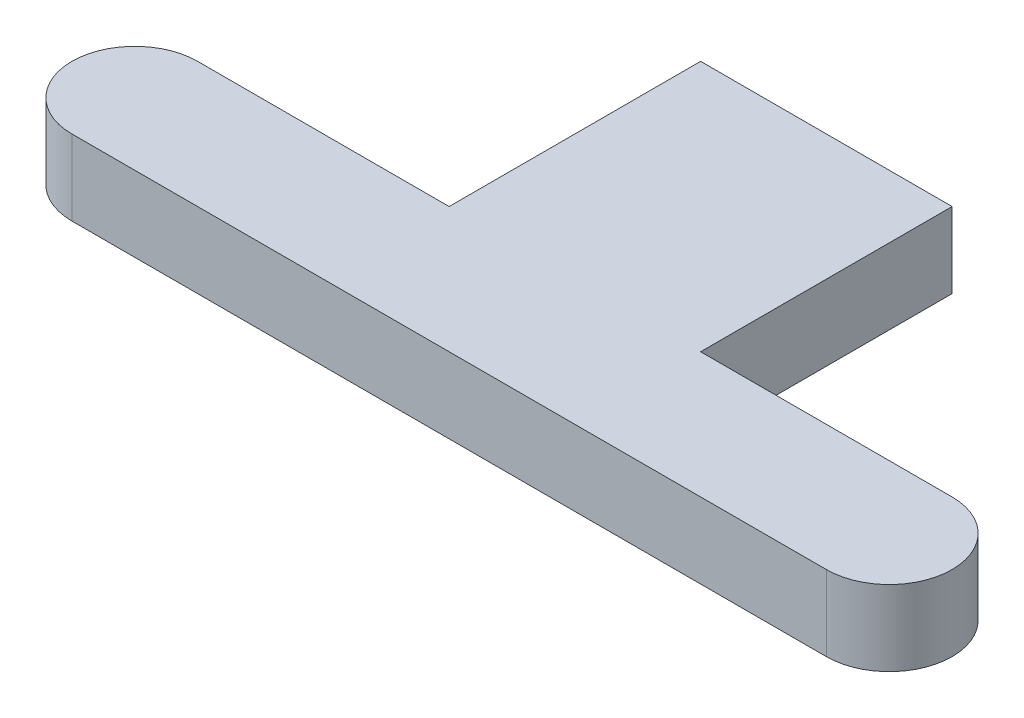
ISO-10303-21;
HEADER;
FILE_DESCRIPTION(('STEP AP214'),'2;1');
FILE_NAME('part.step','',(''),(''),'','','');
FILE_SCHEMA(('AUTOMOTIVE_DESIGN { 1 0 10303 214 1 1 1 1 }'));
ENDSEC;
DATA;
#1=APPLICATION_CONTEXT('core data for automotive mechanical design processes');
#2=APPLICATION_PROTOCOL_DEFINITION('international standard','automotive_design',2000,#1);
#3=PRODUCT_CONTEXT('',#1,'mechanical');
#4=PRODUCT('Part','Part','',(#3));
#5=PRODUCT_RELATED_PRODUCT_CATEGORY('part','',(#4));
#6=PRODUCT_DEFINITION_FORMATION('','',#4);
#7=PRODUCT_DEFINITION_CONTEXT('part definition',#1,'design');
#8=PRODUCT_DEFINITION('design','',#6,#7);
#9=PRODUCT_DEFINITION_SHAPE('','',#8);
#10=(LENGTH_UNIT() NAMED_UNIT(*) SI_UNIT(.MILLI.,.METRE.));
#11=(NAMED_UNIT(*) PLANE_ANGLE_UNIT() SI_UNIT($,.RADIAN.));
#12=(NAMED_UNIT(*) SI_UNIT($,.STERADIAN.) SOLID_ANGLE_UNIT());
#13=UNCERTAINTY_MEASURE_WITH_UNIT(LENGTH_MEASURE(1.E-05),#10,'distance_accuracy_value','');
#14=(GEOMETRIC_REPRESENTATION_CONTEXT(3) GLOBAL_UNCERTAINTY_ASSIGNED_CONTEXT((#13)) GLOBAL_UNIT_ASSIGNED_CONTEXT((#10,
#11,#12)) REPRESENTATION_CONTEXT('',''));
#15=CARTESIAN_POINT('',(0.,0.,0.));
#16=DIRECTION('',(0.,0.,1.));
#17=DIRECTION('',(1.,0.,0.));
#18=AXIS2_PLACEMENT_3D('',#15,#16,#17);
#19=CARTESIAN_POINT('',(-7.49999999999999,3.,-5.));
#20=DIRECTION('',(0.,0.,1.));
#21=DIRECTION('',(1.,0.,0.));
#22=AXIS2_PLACEMENT_3D('',#19,#20,#21);
#23=PLANE('',#22);
#24=DIRECTION('',(0.,-1.,0.));
#25=VECTOR('',#24,1.);
#26=CARTESIAN_POINT('',(12.5,3.,-5.));
#27=LINE('',#26,#25);
#28=CARTESIAN_POINT('',(12.5,3.,-5.));
#29=VERTEX_POINT('',#28);
#30=CARTESIAN_POINT('',(12.5,0.,-5.));
#31=VERTEX_POINT('',#30);
#32=EDGE_CURVE('E63',#29,#31,#27,.T.);
#33=ORIENTED_EDGE('',*,*,#32,.F.);
#34=DIRECTION('',(-1.,0.,0.));
#35=VECTOR('',#34,1.);
#36=CARTESIAN_POINT('',(-7.49999999999999,3.,-5.));
#37=LINE('',#36,#35);
#38=CARTESIAN_POINT('',(22.5,3.,-5.));
#39=VERTEX_POINT('',#38);
#40=EDGE_CURVE('E220',#39,#29,#37,.T.);
#41=ORIENTED_EDGE('',*,*,#40,.F.);
#42=DIRECTION('',(0.,-1.,0.));
#43=VECTOR('',#42,1.);
#44=CARTESIAN_POINT('',(22.5,3.,-5.));
#45=LINE('',#44,#43);
#46=CARTESIAN_POINT('',(22.5,0.,-5.));
#47=VERTEX_POINT('',#46);
#48=EDGE_CURVE('E239',#39,#47,#45,.T.);
#49=ORIENTED_EDGE('',*,*,#48,.T.);
#50=DIRECTION('',(-1.,0.,0.));
#51=VECTOR('',#50,1.);
#52=CARTESIAN_POINT('',(-7.49999999999999,0.,-5.));
#53=LINE('',#52,#51);
#54=EDGE_CURVE('E214',#47,#31,#53,.T.);
#55=ORIENTED_EDGE('',*,*,#54,.T.);
#56=EDGE_LOOP('',(#33,#41,#49,#55));
#57=FACE_BOUND('',#56,.T.);
#58=ADVANCED_FACE('F39',(#57),#23,.F.);
#59=DIRECTION('',(0.,1.,0.));
#60=VECTOR('',#59,1.);
#61=CARTESIAN_POINT('',(2.50000000000001,3.,-5.));
#62=LINE('',#61,#60);
#63=CARTESIAN_POINT('',(2.5,0.,-5.));
#64=VERTEX_POINT('',#63);
#65=CARTESIAN_POINT('',(2.5,3.,-5.));
#66=VERTEX_POINT('',#65);
#67=EDGE_CURVE('E154',#64,#66,#62,.T.);
#68=ORIENTED_EDGE('',*,*,#67,.F.);
#69=CARTESIAN_POINT('',(-7.49999999999999,0.,-5.));
#70=VERTEX_POINT('',#69);
#71=EDGE_CURVE('E233',#64,#70,#53,.T.);
#72=ORIENTED_EDGE('',*,*,#71,.T.);
#73=DIRECTION('',(0.,-1.,0.));
#74=VECTOR('',#73,1.);
#75=CARTESIAN_POINT('',(-7.49999999999999,3.,-5.));
#76=LINE('',#75,#74);
#77=CARTESIAN_POINT('',(-7.49999999999999,3.,-5.));
#78=VERTEX_POINT('',#77);
#79=EDGE_CURVE('E223',#78,#70,#76,.T.);
#80=ORIENTED_EDGE('',*,*,#79,.F.);
#81=EDGE_CURVE('E55',#66,#78,#37,.T.);
#82=ORIENTED_EDGE('',*,*,#81,.F.);
#83=EDGE_LOOP('',(#68,#72,#80,#82));
#84=FACE_BOUND('',#83,.T.);
#85=ADVANCED_FACE('F272',(#84),#23,.F.);
#86=CARTESIAN_POINT('',(-7.49999999999999,3.,-2.49999999999998));
#87=DIRECTION('',(0.,-1.,0.));
#88=DIRECTION('',(0.,0.,-1.));
#89=AXIS2_PLACEMENT_3D('',#86,#87,#88);
#90=CYLINDRICAL_SURFACE('',#89,2.50000000000002);
#91=CARTESIAN_POINT('',(-7.49999999999999,0.,-2.49999999999998));
#92=DIRECTION('',(0.,1.,0.));
#93=DIRECTION('',(0.,0.,1.));
#94=AXIS2_PLACEMENT_3D('',#91,#92,#93);
#95=CIRCLE('',#94,2.50000000000002);
#96=CARTESIAN_POINT('',(-7.49999955071812,0.,0.));
#97=VERTEX_POINT('',#96);
#98=EDGE_CURVE('E199',#70,#97,#95,.T.);
#99=ORIENTED_EDGE('',*,*,#98,.T.);
#100=DIRECTION('',(0.,-1.,0.));
#101=VECTOR('',#100,1.);
#102=CARTESIAN_POINT('',(-7.49999955071812,3.,0.));
#103=LINE('',#102,#101);
#104=CARTESIAN_POINT('',(-7.49999955071812,3.,0.));
#105=VERTEX_POINT('',#104);
#106=EDGE_CURVE('E11',#105,#97,#103,.T.);
#107=ORIENTED_EDGE('',*,*,#106,.F.);
#108=CARTESIAN_POINT('',(-7.49999999999999,3.,-2.49999999999998));
#109=DIRECTION('',(0.,1.,0.));
#110=DIRECTION('',(0.,0.,1.));
#111=AXIS2_PLACEMENT_3D('',#108,#109,#110);
#112=CIRCLE('',#111,2.50000000000002);
#113=EDGE_CURVE('E209',#78,#105,#112,.T.);
#114=ORIENTED_EDGE('',*,*,#113,.F.);
#115=ORIENTED_EDGE('',*,*,#79,.T.);
#116=EDGE_LOOP('',(#99,#107,#114,#115));
#117=FACE_BOUND('',#116,.T.);
#118=ADVANCED_FACE('F41',(#117),#90,.T.);
#119=CARTESIAN_POINT('',(-7.49999955071812,3.,0.));
#120=DIRECTION('',(0.,0.,-1.));
#121=DIRECTION('',(-1.,0.,0.));
#122=AXIS2_PLACEMENT_3D('',#119,#120,#121);
#123=PLANE('',#122);
#124=DIRECTION('',(1.,0.,0.));
#125=VECTOR('',#124,1.);
#126=CARTESIAN_POINT('',(-7.49999955071812,0.,0.));
#127=LINE('',#126,#125);
#128=CARTESIAN_POINT('',(22.5,0.,0.));
#129=VERTEX_POINT('',#128);
#130=EDGE_CURVE('E227',#97,#129,#127,.T.);
#131=ORIENTED_EDGE('',*,*,#130,.T.);
#132=DIRECTION('',(0.,-1.,0.));
#133=VECTOR('',#132,1.);
#134=CARTESIAN_POINT('',(22.5,3.,0.));
#135=LINE('',#134,#133);
#136=CARTESIAN_POINT('',(22.5,3.,0.));
#137=VERTEX_POINT('',#136);
#138=EDGE_CURVE('E48',#137,#129,#135,.T.);
#139=ORIENTED_EDGE('',*,*,#138,.F.);
#140=DIRECTION('',(1.,0.,0.));
#141=VECTOR('',#140,1.);
#142=CARTESIAN_POINT('',(-7.49999955071812,3.,0.));
#143=LINE('',#142,#141);
#144=EDGE_CURVE('E213',#105,#137,#143,.T.);
#145=ORIENTED_EDGE('',*,*,#144,.F.);
#146=ORIENTED_EDGE('',*,*,#106,.T.);
#147=EDGE_LOOP('',(#131,#139,#145,#146));
#148=FACE_BOUND('',#147,.T.);
#149=ADVANCED_FACE('F274',(#148),#123,.F.);
#150=CARTESIAN_POINT('',(22.5,3.,-2.5));
#151=DIRECTION('',(0.,-1.,0.));
#152=DIRECTION('',(0.,0.,-1.));
#153=AXIS2_PLACEMENT_3D('',#150,#151,#152);
#154=CYLINDRICAL_SURFACE('',#153,2.5);
#155=CARTESIAN_POINT('',(22.5,0.,-2.5));
#156=DIRECTION('',(0.,1.,0.));
#157=DIRECTION('',(0.,0.,1.));
#158=AXIS2_PLACEMENT_3D('',#155,#156,#157);
#159=CIRCLE('',#158,2.5);
#160=EDGE_CURVE('E230',#129,#47,#159,.T.);
#161=ORIENTED_EDGE('',*,*,#160,.T.);
#162=ORIENTED_EDGE('',*,*,#48,.F.);
#163=CARTESIAN_POINT('',(22.5,3.,-2.5));
#164=DIRECTION('',(0.,1.,0.));
#165=DIRECTION('',(0.,0.,1.));
#166=AXIS2_PLACEMENT_3D('',#163,#164,#165);
#167=CIRCLE('',#166,2.5);
#168=EDGE_CURVE('E217',#137,#39,#167,.T.);
#169=ORIENTED_EDGE('',*,*,#168,.F.);
#170=ORIENTED_EDGE('',*,*,#138,.T.);
#171=EDGE_LOOP('',(#161,#162,#169,#170));
#172=FACE_BOUND('',#171,.T.);
#173=ADVANCED_FACE('F248',(#172),#154,.T.);
#174=CARTESIAN_POINT('',(-7.49999999999999,3.,-2.49999999999998));
#175=DIRECTION('',(0.,1.,0.));
#176=DIRECTION('',(0.,0.,1.));
#177=AXIS2_PLACEMENT_3D('',#174,#175,#176);
#178=PLANE('',#177);
#179=ORIENTED_EDGE('',*,*,#113,.T.);
#180=ORIENTED_EDGE('',*,*,#144,.T.);
#181=ORIENTED_EDGE('',*,*,#168,.T.);
#182=ORIENTED_EDGE('',*,*,#40,.T.);
#183=DIRECTION('',(0.,0.,1.));
#184=VECTOR('',#183,1.);
#185=CARTESIAN_POINT('',(12.5,3.,-15.));
#186=LINE('',#185,#184);
#187=CARTESIAN_POINT('',(12.5,3.,-15.));
#188=VERTEX_POINT('',#187);
#189=EDGE_CURVE('E253',#188,#29,#186,.T.);
#190=ORIENTED_EDGE('',*,*,#189,.F.);
#191=DIRECTION('',(1.,0.,0.));
#192=VECTOR('',#191,1.);
#193=CARTESIAN_POINT('',(12.5,3.,-15.));
#194=LINE('',#193,#192);
#195=CARTESIAN_POINT('',(2.5,3.,-15.));
#196=VERTEX_POINT('',#195);
#197=EDGE_CURVE('E149',#196,#188,#194,.T.);
#198=ORIENTED_EDGE('',*,*,#197,.F.);
#199=DIRECTION('',(0.,0.,1.));
#200=VECTOR('',#199,1.);
#201=CARTESIAN_POINT('',(2.5,3.,-15.));
#202=LINE('',#201,#200);
#203=EDGE_CURVE('E164',#196,#66,#202,.T.);
#204=ORIENTED_EDGE('',*,*,#203,.T.);
#205=ORIENTED_EDGE('',*,*,#81,.T.);
#206=EDGE_LOOP('',(#179,#180,#181,#182,#190,#198,#204,#205));
#207=FACE_BOUND('',#206,.T.);
#208=ADVANCED_FACE('F252',(#207),#178,.T.);
#209=CARTESIAN_POINT('',(-7.49999999999999,0.,-2.49999999999998));
#210=DIRECTION('',(0.,1.,0.));
#211=DIRECTION('',(0.,0.,1.));
#212=AXIS2_PLACEMENT_3D('',#209,#210,#211);
#213=PLANE('',#212);
#214=DIRECTION('',(1.,0.,0.));
#215=VECTOR('',#214,1.);
#216=CARTESIAN_POINT('',(-7.49999999999999,0.,-4.));
#217=LINE('',#216,#215);
#218=CARTESIAN_POINT('',(-7.49999999999999,0.,-4.));
#219=VERTEX_POINT('',#218);
#220=CARTESIAN_POINT('',(22.5,0.,-4.));
#221=VERTEX_POINT('',#220);
#222=EDGE_CURVE('E162',#219,#221,#217,.T.);
#223=ORIENTED_EDGE('',*,*,#222,.F.);
#224=CARTESIAN_POINT('',(-7.49999999999999,0.,-2.49999999999998));
#225=DIRECTION('',(0.,-1.,0.));
#226=DIRECTION('',(0.,0.,-1.));
#227=AXIS2_PLACEMENT_3D('',#224,#225,#226);
#228=CIRCLE('',#227,1.50000000000002);
#229=CARTESIAN_POINT('',(-7.49999973043087,0.,-0.999999999999984));
#230=VERTEX_POINT('',#229);
#231=EDGE_CURVE('E158',#230,#219,#228,.T.);
#232=ORIENTED_EDGE('',*,*,#231,.F.);
#233=DIRECTION('',(-1.,0.,0.));
#234=VECTOR('',#233,1.);
#235=CARTESIAN_POINT('',(22.5,0.,-1.));
#236=LINE('',#235,#234);
#237=CARTESIAN_POINT('',(22.5,0.,-1.));
#238=VERTEX_POINT('',#237);
#239=EDGE_CURVE('E173',#238,#230,#236,.T.);
#240=ORIENTED_EDGE('',*,*,#239,.F.);
#241=CARTESIAN_POINT('',(22.5,0.,-2.5));
#242=DIRECTION('',(0.,-1.,0.));
#243=DIRECTION('',(0.,0.,-1.));
#244=AXIS2_PLACEMENT_3D('',#241,#242,#243);
#245=CIRCLE('',#244,1.5);
#246=EDGE_CURVE('E189',#221,#238,#245,.T.);
#247=ORIENTED_EDGE('',*,*,#246,.F.);
#248=EDGE_LOOP('',(#223,#232,#240,#247));
#249=FACE_BOUND('',#248,.T.);
#250=ORIENTED_EDGE('',*,*,#98,.F.);
#251=ORIENTED_EDGE('',*,*,#71,.F.);
#252=DIRECTION('',(0.,0.,1.));
#253=VECTOR('',#252,1.);
#254=CARTESIAN_POINT('',(2.5,0.,-15.));
#255=LINE('',#254,#253);
#256=CARTESIAN_POINT('',(2.5,0.,-15.));
#257=VERTEX_POINT('',#256);
#258=EDGE_CURVE('E139',#257,#64,#255,.T.);
#259=ORIENTED_EDGE('',*,*,#258,.F.);
#260=DIRECTION('',(-1.,0.,0.));
#261=VECTOR('',#260,1.);
#262=CARTESIAN_POINT('',(12.5,0.,-15.));
#263=LINE('',#262,#261);
#264=CARTESIAN_POINT('',(12.5,0.,-15.));
#265=VERTEX_POINT('',#264);
#266=EDGE_CURVE('E131',#265,#257,#263,.T.);
#267=ORIENTED_EDGE('',*,*,#266,.F.);
#268=DIRECTION('',(0.,0.,1.));
#269=VECTOR('',#268,1.);
#270=CARTESIAN_POINT('',(12.5,0.,-15.));
#271=LINE('',#270,#269);
#272=EDGE_CURVE('E137',#265,#31,#271,.T.);
#273=ORIENTED_EDGE('',*,*,#272,.T.);
#274=ORIENTED_EDGE('',*,*,#54,.F.);
#275=ORIENTED_EDGE('',*,*,#160,.F.);
#276=ORIENTED_EDGE('',*,*,#130,.F.);
#277=EDGE_LOOP('',(#250,#251,#259,#267,#273,#274,#275,#276));
#278=FACE_BOUND('',#277,.T.);
#279=ADVANCED_FACE('F134',(#249,#278),#213,.F.);
#280=CARTESIAN_POINT('',(-7.49999999999999,1.5,-2.49999999999998));
#281=DIRECTION('',(0.,-1.,0.));
#282=DIRECTION('',(0.,0.,-1.));
#283=AXIS2_PLACEMENT_3D('',#280,#281,#282);
#284=CYLINDRICAL_SURFACE('',#283,1.50000000000002);
#285=ORIENTED_EDGE('',*,*,#231,.T.);
#286=DIRECTION('',(0.,-1.,0.));
#287=VECTOR('',#286,1.);
#288=CARTESIAN_POINT('',(-7.49999999999999,1.5,-4.));
#289=LINE('',#288,#287);
#290=CARTESIAN_POINT('',(-7.49999999999999,1.5,-4.));
#291=VERTEX_POINT('',#290);
#292=EDGE_CURVE('E184',#291,#219,#289,.T.);
#293=ORIENTED_EDGE('',*,*,#292,.F.);
#294=CARTESIAN_POINT('',(-7.49999999999999,1.5,-2.49999999999998));
#295=DIRECTION('',(0.,-1.,0.));
#296=DIRECTION('',(0.,0.,-1.));
#297=AXIS2_PLACEMENT_3D('',#294,#295,#296);
#298=CIRCLE('',#297,1.50000000000002);
#299=CARTESIAN_POINT('',(-7.49999973043087,1.5,-0.999999999999984));
#300=VERTEX_POINT('',#299);
#301=EDGE_CURVE('E168',#300,#291,#298,.T.);
#302=ORIENTED_EDGE('',*,*,#301,.F.);
#303=DIRECTION('',(0.,-1.,0.));
#304=VECTOR('',#303,1.);
#305=CARTESIAN_POINT('',(-7.49999973043087,1.5,-0.999999999999984));
#306=LINE('',#305,#304);
#307=EDGE_CURVE('E196',#300,#230,#306,.T.);
#308=ORIENTED_EDGE('',*,*,#307,.T.);
#309=EDGE_LOOP('',(#285,#293,#302,#308));
#310=FACE_BOUND('',#309,.T.);
#311=ADVANCED_FACE('F289',(#310),#284,.F.);
#312=CARTESIAN_POINT('',(22.5,1.5,-1.));
#313=DIRECTION('',(0.,0.,1.));
#314=DIRECTION('',(1.,0.,0.));
#315=AXIS2_PLACEMENT_3D('',#312,#313,#314);
#316=PLANE('',#315);
#317=ORIENTED_EDGE('',*,*,#239,.T.);
#318=ORIENTED_EDGE('',*,*,#307,.F.);
#319=DIRECTION('',(-1.,0.,0.));
#320=VECTOR('',#319,1.);
#321=CARTESIAN_POINT('',(22.5,1.5,-1.));
#322=LINE('',#321,#320);
#323=CARTESIAN_POINT('',(22.5,1.5,-1.));
#324=VERTEX_POINT('',#323);
#325=EDGE_CURVE('E181',#324,#300,#322,.T.);
#326=ORIENTED_EDGE('',*,*,#325,.F.);
#327=DIRECTION('',(0.,-1.,0.));
#328=VECTOR('',#327,1.);
#329=CARTESIAN_POINT('',(22.5,1.5,-1.));
#330=LINE('',#329,#328);
#331=EDGE_CURVE('E200',#324,#238,#330,.T.);
#332=ORIENTED_EDGE('',*,*,#331,.T.);
#333=EDGE_LOOP('',(#317,#318,#326,#332));
#334=FACE_BOUND('',#333,.T.);
#335=ADVANCED_FACE('F295',(#334),#316,.F.);
#336=CARTESIAN_POINT('',(22.5,1.5,-2.5));
#337=DIRECTION('',(0.,-1.,0.));
#338=DIRECTION('',(0.,0.,-1.));
#339=AXIS2_PLACEMENT_3D('',#336,#337,#338);
#340=CYLINDRICAL_SURFACE('',#339,1.5);
#341=ORIENTED_EDGE('',*,*,#246,.T.);
#342=ORIENTED_EDGE('',*,*,#331,.F.);
#343=CARTESIAN_POINT('',(22.5,1.5,-2.5));
#344=DIRECTION('',(0.,-1.,0.));
#345=DIRECTION('',(0.,0.,-1.));
#346=AXIS2_PLACEMENT_3D('',#343,#344,#345);
#347=CIRCLE('',#346,1.5);
#348=CARTESIAN_POINT('',(22.5,1.5,-4.));
#349=VERTEX_POINT('',#348);
#350=EDGE_CURVE('E177',#349,#324,#347,.T.);
#351=ORIENTED_EDGE('',*,*,#350,.F.);
#352=DIRECTION('',(0.,-1.,0.));
#353=VECTOR('',#352,1.);
#354=CARTESIAN_POINT('',(22.5,1.5,-4.));
#355=LINE('',#354,#353);
#356=EDGE_CURVE('E203',#349,#221,#355,.T.);
#357=ORIENTED_EDGE('',*,*,#356,.T.);
#358=EDGE_LOOP('',(#341,#342,#351,#357));
#359=FACE_BOUND('',#358,.T.);
#360=ADVANCED_FACE('F301',(#359),#340,.F.);
#361=CARTESIAN_POINT('',(-7.49999999999999,1.5,-4.));
#362=DIRECTION('',(0.,0.,-1.));
#363=DIRECTION('',(-1.,0.,0.));
#364=AXIS2_PLACEMENT_3D('',#361,#362,#363);
#365=PLANE('',#364);
#366=ORIENTED_EDGE('',*,*,#222,.T.);
#367=ORIENTED_EDGE('',*,*,#356,.F.);
#368=DIRECTION('',(1.,0.,0.));
#369=VECTOR('',#368,1.);
#370=CARTESIAN_POINT('',(-7.49999999999999,1.5,-4.));
#371=LINE('',#370,#369);
#372=EDGE_CURVE('E172',#291,#349,#371,.T.);
#373=ORIENTED_EDGE('',*,*,#372,.F.);
#374=ORIENTED_EDGE('',*,*,#292,.T.);
#375=EDGE_LOOP('',(#366,#367,#373,#374));
#376=FACE_BOUND('',#375,.T.);
#377=ADVANCED_FACE('F297',(#376),#365,.F.);
#378=CARTESIAN_POINT('',(-7.49999999999999,1.5,-2.49999999999998));
#379=DIRECTION('',(0.,-1.,0.));
#380=DIRECTION('',(0.,0.,-1.));
#381=AXIS2_PLACEMENT_3D('',#378,#379,#380);
#382=PLANE('',#381);
#383=ORIENTED_EDGE('',*,*,#301,.T.);
#384=ORIENTED_EDGE('',*,*,#372,.T.);
#385=ORIENTED_EDGE('',*,*,#350,.T.);
#386=ORIENTED_EDGE('',*,*,#325,.T.);
#387=EDGE_LOOP('',(#383,#384,#385,#386));
#388=FACE_BOUND('',#387,.T.);
#389=ADVANCED_FACE('F300',(#388),#382,.T.);
#390=CARTESIAN_POINT('',(12.5,3.,-15.));
#391=DIRECTION('',(-1.,0.,0.));
#392=DIRECTION('',(0.,0.,1.));
#393=AXIS2_PLACEMENT_3D('',#390,#391,#392);
#394=PLANE('',#393);
#395=ORIENTED_EDGE('',*,*,#32,.T.);
#396=ORIENTED_EDGE('',*,*,#272,.F.);
#397=DIRECTION('',(0.,-1.,0.));
#398=VECTOR('',#397,1.);
#399=CARTESIAN_POINT('',(12.5,3.,-15.));
#400=LINE('',#399,#398);
#401=EDGE_CURVE('E144',#188,#265,#400,.T.);
#402=ORIENTED_EDGE('',*,*,#401,.F.);
#403=ORIENTED_EDGE('',*,*,#189,.T.);
#404=EDGE_LOOP('',(#395,#396,#402,#403));
#405=FACE_BOUND('',#404,.T.);
#406=ADVANCED_FACE('F156',(#405),#394,.F.);
#407=CARTESIAN_POINT('',(2.5,3.,-15.));
#408=DIRECTION('',(1.,0.,0.));
#409=DIRECTION('',(0.,1.,0.));
#410=AXIS2_PLACEMENT_3D('',#407,#408,#409);
#411=PLANE('',#410);
#412=ORIENTED_EDGE('',*,*,#67,.T.);
#413=ORIENTED_EDGE('',*,*,#203,.F.);
#414=DIRECTION('',(0.,1.,0.));
#415=VECTOR('',#414,1.);
#416=CARTESIAN_POINT('',(2.5,3.,-15.));
#417=LINE('',#416,#415);
#418=EDGE_CURVE('E143',#257,#196,#417,.T.);
#419=ORIENTED_EDGE('',*,*,#418,.F.);
#420=ORIENTED_EDGE('',*,*,#258,.T.);
#421=EDGE_LOOP('',(#412,#413,#419,#420));
#422=FACE_BOUND('',#421,.T.);
#423=ADVANCED_FACE('F268',(#422),#411,.F.);
#424=CARTESIAN_POINT('',(0.,0.,-15.));
#425=DIRECTION('',(0.,0.,-1.));
#426=DIRECTION('',(-1.,0.,0.));
#427=AXIS2_PLACEMENT_3D('',#424,#425,#426);
#428=PLANE('',#427);
#429=ORIENTED_EDGE('',*,*,#401,.T.);
#430=ORIENTED_EDGE('',*,*,#266,.T.);
#431=ORIENTED_EDGE('',*,*,#418,.T.);
#432=ORIENTED_EDGE('',*,*,#197,.T.);
#433=EDGE_LOOP('',(#429,#430,#431,#432));
#434=FACE_BOUND('',#433,.T.);
#435=ADVANCED_FACE('F147',(#434),#428,.T.);
#436=CLOSED_SHELL('',(#58,#85,#118,#149,#173,#208,#279,#311,#335,#360,#377,#389,#406,#423,#435));
#437=MANIFOLD_SOLID_BREP('B2',#436);
#438=ADVANCED_BREP_SHAPE_REPRESENTATION('',(#18,#437),#14);
#439=SHAPE_DEFINITION_REPRESENTATION(#9,#438);
ENDSEC;
END-ISO-10303-21;
